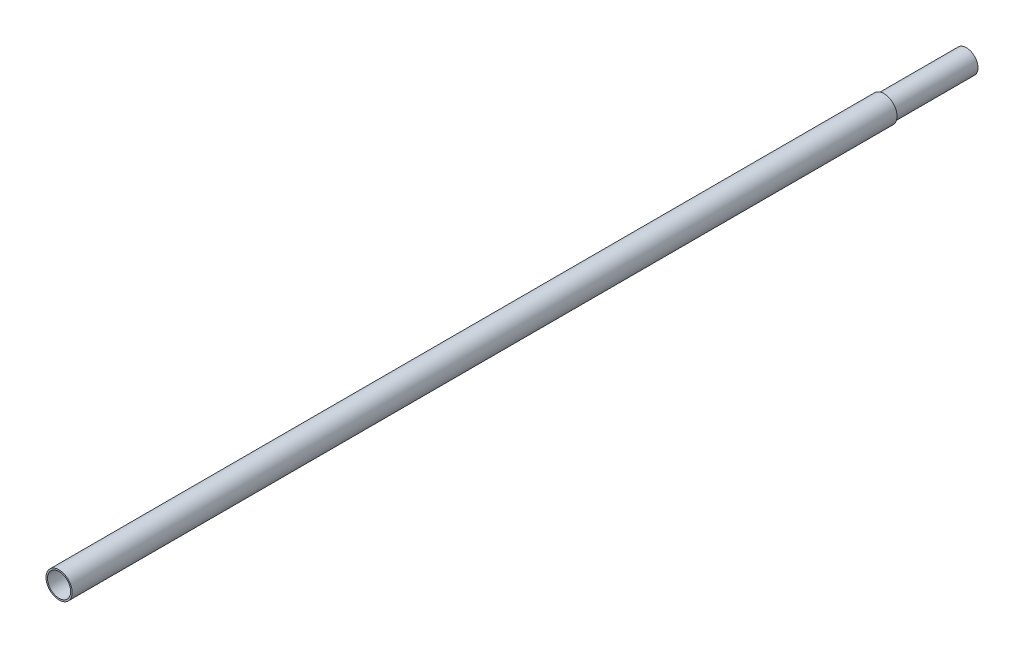
ISO-10303-21;
HEADER;
FILE_DESCRIPTION(('STEP AP214'),'2;1');
FILE_NAME('part.step','',(''),(''),'','','');
FILE_SCHEMA(('AUTOMOTIVE_DESIGN { 1 0 10303 214 1 1 1 1 }'));
ENDSEC;
DATA;
#1=APPLICATION_CONTEXT('core data for automotive mechanical design processes');
#2=APPLICATION_PROTOCOL_DEFINITION('international standard','automotive_design',2000,#1);
#3=PRODUCT_CONTEXT('',#1,'mechanical');
#4=PRODUCT('Part','Part','',(#3));
#5=PRODUCT_RELATED_PRODUCT_CATEGORY('part','',(#4));
#6=PRODUCT_DEFINITION_FORMATION('','',#4);
#7=PRODUCT_DEFINITION_CONTEXT('part definition',#1,'design');
#8=PRODUCT_DEFINITION('design','',#6,#7);
#9=PRODUCT_DEFINITION_SHAPE('','',#8);
#10=(LENGTH_UNIT() NAMED_UNIT(*) SI_UNIT(.MILLI.,.METRE.));
#11=(NAMED_UNIT(*) PLANE_ANGLE_UNIT() SI_UNIT($,.RADIAN.));
#12=(NAMED_UNIT(*) SI_UNIT($,.STERADIAN.) SOLID_ANGLE_UNIT());
#13=UNCERTAINTY_MEASURE_WITH_UNIT(LENGTH_MEASURE(1.E-05),#10,'distance_accuracy_value','');
#14=(GEOMETRIC_REPRESENTATION_CONTEXT(3) GLOBAL_UNCERTAINTY_ASSIGNED_CONTEXT((#13)) GLOBAL_UNIT_ASSIGNED_CONTEXT((#10,
#11,#12)) REPRESENTATION_CONTEXT('',''));
#15=CARTESIAN_POINT('',(0.,0.,0.));
#16=DIRECTION('',(0.,0.,1.));
#17=DIRECTION('',(1.,0.,0.));
#18=AXIS2_PLACEMENT_3D('',#15,#16,#17);
#19=CARTESIAN_POINT('',(0.,0.,380.));
#20=DIRECTION('',(0.,0.,-1.));
#21=DIRECTION('',(-1.,0.,0.));
#22=AXIS2_PLACEMENT_3D('',#19,#20,#21);
#23=CYLINDRICAL_SURFACE('',#22,11.227);
#24=CARTESIAN_POINT('',(0.,0.,0.));
#25=DIRECTION('',(0.,0.,1.));
#26=DIRECTION('',(1.,0.,0.));
#27=AXIS2_PLACEMENT_3D('',#24,#25,#26);
#28=CIRCLE('',#27,11.227);
#29=CARTESIAN_POINT('',(11.227,0.,0.));
#30=VERTEX_POINT('',#29);
#31=EDGE_CURVE('E54',#30,#30,#28,.T.);
#32=ORIENTED_EDGE('',*,*,#31,.T.);
#33=EDGE_LOOP('',(#32));
#34=FACE_BOUND('',#33,.T.);
#35=CARTESIAN_POINT('',(0.,0.,80.));
#36=DIRECTION('',(0.,0.,1.));
#37=DIRECTION('',(1.,0.,0.));
#38=AXIS2_PLACEMENT_3D('',#35,#36,#37);
#39=CIRCLE('',#38,11.227);
#40=CARTESIAN_POINT('',(11.227,0.,80.));
#41=VERTEX_POINT('',#40);
#42=EDGE_CURVE('E10',#41,#41,#39,.T.);
#43=ORIENTED_EDGE('',*,*,#42,.F.);
#44=EDGE_LOOP('',(#43));
#45=FACE_BOUND('',#44,.T.);
#46=ADVANCED_FACE('F47',(#34,#45),#23,.T.);
#47=CARTESIAN_POINT('',(0.,0.,380.));
#48=DIRECTION('',(0.,0.,1.));
#49=DIRECTION('',(1.,0.,0.));
#50=AXIS2_PLACEMENT_3D('',#47,#48,#49);
#51=PLANE('',#50);
#52=CARTESIAN_POINT('',(0.,0.,380.));
#53=DIRECTION('',(0.,0.,1.));
#54=DIRECTION('',(1.,0.,0.));
#55=AXIS2_PLACEMENT_3D('',#52,#53,#54);
#56=CIRCLE('',#55,11.227);
#57=CARTESIAN_POINT('',(11.227,0.,380.));
#58=VERTEX_POINT('',#57);
#59=EDGE_CURVE('E66',#58,#58,#56,.F.);
#60=ORIENTED_EDGE('',*,*,#59,.F.);
#61=EDGE_LOOP('',(#60));
#62=FACE_BOUND('',#61,.T.);
#63=CARTESIAN_POINT('',(0.,0.,380.));
#64=DIRECTION('',(0.,0.,1.));
#65=DIRECTION('',(1.,0.,0.));
#66=AXIS2_PLACEMENT_3D('',#63,#64,#65);
#67=CIRCLE('',#66,9.6395);
#68=CARTESIAN_POINT('',(9.6395,0.,380.));
#69=VERTEX_POINT('',#68);
#70=EDGE_CURVE('E58',#69,#69,#67,.T.);
#71=ORIENTED_EDGE('',*,*,#70,.F.);
#72=EDGE_LOOP('',(#71));
#73=FACE_BOUND('',#72,.T.);
#74=ADVANCED_FACE('F100',(#62,#73),#51,.T.);
#75=CARTESIAN_POINT('',(0.,0.,0.));
#76=DIRECTION('',(0.,0.,1.));
#77=DIRECTION('',(1.,0.,0.));
#78=AXIS2_PLACEMENT_3D('',#75,#76,#77);
#79=PLANE('',#78);
#80=ORIENTED_EDGE('',*,*,#31,.F.);
#81=EDGE_LOOP('',(#80));
#82=FACE_BOUND('',#81,.T.);
#83=CARTESIAN_POINT('',(0.,0.,0.));
#84=DIRECTION('',(0.,0.,1.));
#85=DIRECTION('',(1.,0.,0.));
#86=AXIS2_PLACEMENT_3D('',#83,#84,#85);
#87=CIRCLE('',#86,9.6395);
#88=CARTESIAN_POINT('',(9.6395,0.,0.));
#89=VERTEX_POINT('',#88);
#90=EDGE_CURVE('E62',#89,#89,#87,.T.);
#91=ORIENTED_EDGE('',*,*,#90,.T.);
#92=EDGE_LOOP('',(#91));
#93=FACE_BOUND('',#92,.T.);
#94=ADVANCED_FACE('F94',(#82,#93),#79,.F.);
#95=CARTESIAN_POINT('',(0.,0.,380.));
#96=DIRECTION('',(0.,0.,-1.));
#97=DIRECTION('',(-1.,0.,0.));
#98=AXIS2_PLACEMENT_3D('',#95,#96,#97);
#99=CYLINDRICAL_SURFACE('',#98,9.6395);
#100=ORIENTED_EDGE('',*,*,#70,.T.);
#101=EDGE_LOOP('',(#100));
#102=FACE_BOUND('',#101,.T.);
#103=ORIENTED_EDGE('',*,*,#90,.F.);
#104=EDGE_LOOP('',(#103));
#105=FACE_BOUND('',#104,.T.);
#106=ADVANCED_FACE('F85',(#102,#105),#99,.F.);
#107=CARTESIAN_POINT('',(0.,0.,880.));
#108=DIRECTION('',(0.,0.,1.));
#109=DIRECTION('',(1.,0.,0.));
#110=AXIS2_PLACEMENT_3D('',#107,#108,#109);
#111=PLANE('',#110);
#112=CARTESIAN_POINT('',(0.,0.,880.));
#113=DIRECTION('',(0.,0.,1.));
#114=DIRECTION('',(1.,0.,0.));
#115=AXIS2_PLACEMENT_3D('',#112,#113,#114);
#116=CIRCLE('',#115,12.7);
#117=CARTESIAN_POINT('',(12.7,0.,880.));
#118=VERTEX_POINT('',#117);
#119=EDGE_CURVE('E70',#118,#118,#116,.T.);
#120=ORIENTED_EDGE('',*,*,#119,.T.);
#121=EDGE_LOOP('',(#120));
#122=FACE_BOUND('',#121,.T.);
#123=CARTESIAN_POINT('',(0.,0.,880.));
#124=DIRECTION('',(0.,0.,1.));
#125=DIRECTION('',(1.,0.,0.));
#126=AXIS2_PLACEMENT_3D('',#123,#124,#125);
#127=CIRCLE('',#126,11.227);
#128=CARTESIAN_POINT('',(11.227,0.,880.));
#129=VERTEX_POINT('',#128);
#130=EDGE_CURVE('E74',#129,#129,#127,.T.);
#131=ORIENTED_EDGE('',*,*,#130,.F.);
#132=EDGE_LOOP('',(#131));
#133=FACE_BOUND('',#132,.T.);
#134=ADVANCED_FACE('F82',(#122,#133),#111,.T.);
#135=CARTESIAN_POINT('',(0.,0.,80.));
#136=DIRECTION('',(0.,0.,1.));
#137=DIRECTION('',(1.,0.,0.));
#138=AXIS2_PLACEMENT_3D('',#135,#136,#137);
#139=PLANE('',#138);
#140=CARTESIAN_POINT('',(0.,0.,80.));
#141=DIRECTION('',(0.,0.,1.));
#142=DIRECTION('',(1.,0.,0.));
#143=AXIS2_PLACEMENT_3D('',#140,#141,#142);
#144=CIRCLE('',#143,12.7);
#145=CARTESIAN_POINT('',(12.7,0.,80.));
#146=VERTEX_POINT('',#145);
#147=EDGE_CURVE('E71',#146,#146,#144,.T.);
#148=ORIENTED_EDGE('',*,*,#147,.F.);
#149=EDGE_LOOP('',(#148));
#150=FACE_BOUND('',#149,.T.);
#151=ORIENTED_EDGE('',*,*,#42,.T.);
#152=EDGE_LOOP('',(#151));
#153=FACE_BOUND('',#152,.T.);
#154=ADVANCED_FACE('F84',(#150,#153),#139,.F.);
#155=CARTESIAN_POINT('',(0.,0.,880.));
#156=DIRECTION('',(0.,0.,-1.));
#157=DIRECTION('',(-1.,0.,0.));
#158=AXIS2_PLACEMENT_3D('',#155,#156,#157);
#159=CYLINDRICAL_SURFACE('',#158,12.7);
#160=ORIENTED_EDGE('',*,*,#119,.F.);
#161=EDGE_LOOP('',(#160));
#162=FACE_BOUND('',#161,.T.);
#163=ORIENTED_EDGE('',*,*,#147,.T.);
#164=EDGE_LOOP('',(#163));
#165=FACE_BOUND('',#164,.T.);
#166=ADVANCED_FACE('F91',(#162,#165),#159,.T.);
#167=CARTESIAN_POINT('',(0.,0.,880.));
#168=DIRECTION('',(0.,0.,-1.));
#169=DIRECTION('',(-1.,0.,0.));
#170=AXIS2_PLACEMENT_3D('',#167,#168,#169);
#171=CYLINDRICAL_SURFACE('',#170,11.227);
#172=ORIENTED_EDGE('',*,*,#59,.T.);
#173=EDGE_LOOP('',(#172));
#174=FACE_BOUND('',#173,.T.);
#175=ORIENTED_EDGE('',*,*,#130,.T.);
#176=EDGE_LOOP('',(#175));
#177=FACE_BOUND('',#176,.T.);
#178=ADVANCED_FACE('F80',(#174,#177),#171,.F.);
#179=CLOSED_SHELL('',(#46,#74,#94,#106,#134,#154,#166,#178));
#180=MANIFOLD_SOLID_BREP('B2',#179);
#181=ADVANCED_BREP_SHAPE_REPRESENTATION('',(#18,#180),#14);
#182=SHAPE_DEFINITION_REPRESENTATION(#9,#181);
ENDSEC;
END-ISO-10303-21;
